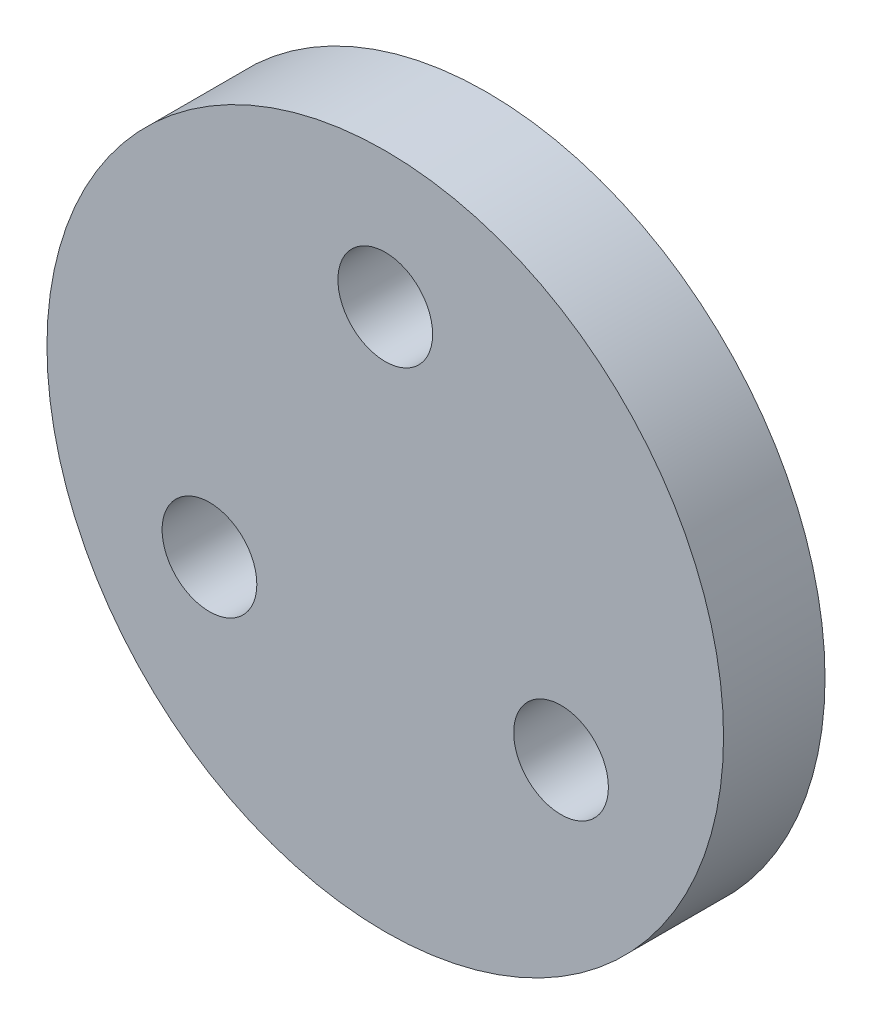
ISO-10303-21;
HEADER;
FILE_DESCRIPTION(('STEP AP214'),'2;1');
FILE_NAME('part.step','',(''),(''),'','','');
FILE_SCHEMA(('AUTOMOTIVE_DESIGN { 1 0 10303 214 1 1 1 1 }'));
ENDSEC;
DATA;
#1=APPLICATION_CONTEXT('core data for automotive mechanical design processes');
#2=APPLICATION_PROTOCOL_DEFINITION('international standard','automotive_design',2000,#1);
#3=PRODUCT_CONTEXT('',#1,'mechanical');
#4=PRODUCT('Part','Part','',(#3));
#5=PRODUCT_RELATED_PRODUCT_CATEGORY('part','',(#4));
#6=PRODUCT_DEFINITION_FORMATION('','',#4);
#7=PRODUCT_DEFINITION_CONTEXT('part definition',#1,'design');
#8=PRODUCT_DEFINITION('design','',#6,#7);
#9=PRODUCT_DEFINITION_SHAPE('','',#8);
#10=(LENGTH_UNIT() NAMED_UNIT(*) SI_UNIT(.MILLI.,.METRE.));
#11=(NAMED_UNIT(*) PLANE_ANGLE_UNIT() SI_UNIT($,.RADIAN.));
#12=(NAMED_UNIT(*) SI_UNIT($,.STERADIAN.) SOLID_ANGLE_UNIT());
#13=UNCERTAINTY_MEASURE_WITH_UNIT(LENGTH_MEASURE(1.E-05),#10,'distance_accuracy_value','');
#14=(GEOMETRIC_REPRESENTATION_CONTEXT(3) GLOBAL_UNCERTAINTY_ASSIGNED_CONTEXT((#13)) GLOBAL_UNIT_ASSIGNED_CONTEXT((#10,
#11,#12)) REPRESENTATION_CONTEXT('',''));
#15=CARTESIAN_POINT('',(0.,0.,0.));
#16=DIRECTION('',(0.,0.,1.));
#17=DIRECTION('',(1.,0.,0.));
#18=AXIS2_PLACEMENT_3D('',#15,#16,#17);
#19=CARTESIAN_POINT('',(0.,0.,5.));
#20=DIRECTION('',(0.,0.,-1.));
#21=DIRECTION('',(-1.,0.,0.));
#22=AXIS2_PLACEMENT_3D('',#19,#20,#21);
#23=CYLINDRICAL_SURFACE('',#22,3.);
#24=CARTESIAN_POINT('',(0.,0.,1.00000000000001));
#25=DIRECTION('',(0.,0.,1.));
#26=DIRECTION('',(1.,0.,0.));
#27=AXIS2_PLACEMENT_3D('',#24,#25,#26);
#28=CIRCLE('',#27,3.);
#29=CARTESIAN_POINT('',(3.,0.,1.00000000000001));
#30=VERTEX_POINT('',#29);
#31=EDGE_CURVE('E54',#30,#30,#28,.T.);
#32=ORIENTED_EDGE('',*,*,#31,.T.);
#33=EDGE_LOOP('',(#32));
#34=FACE_BOUND('',#33,.T.);
#35=CARTESIAN_POINT('',(0.,0.,5.));
#36=DIRECTION('',(0.,0.,1.));
#37=DIRECTION('',(1.,0.,0.));
#38=AXIS2_PLACEMENT_3D('',#35,#36,#37);
#39=CIRCLE('',#38,3.);
#40=CARTESIAN_POINT('',(3.,0.,5.));
#41=VERTEX_POINT('',#40);
#42=EDGE_CURVE('E59',#41,#41,#39,.T.);
#43=ORIENTED_EDGE('',*,*,#42,.F.);
#44=EDGE_LOOP('',(#43));
#45=FACE_BOUND('',#44,.T.);
#46=ADVANCED_FACE('F45',(#34,#45),#23,.T.);
#47=CARTESIAN_POINT('',(0.,0.,0.));
#48=DIRECTION('',(0.,0.,1.));
#49=DIRECTION('',(1.,0.,0.));
#50=AXIS2_PLACEMENT_3D('',#47,#48,#49);
#51=PLANE('',#50);
#52=CARTESIAN_POINT('',(0.,0.,0.));
#53=DIRECTION('',(0.,0.,1.));
#54=DIRECTION('',(1.,0.,0.));
#55=AXIS2_PLACEMENT_3D('',#52,#53,#54);
#56=CIRCLE('',#55,1.99999999999999);
#57=CARTESIAN_POINT('',(1.99999999999999,0.,0.));
#58=VERTEX_POINT('',#57);
#59=EDGE_CURVE('E10',#58,#58,#56,.F.);
#60=ORIENTED_EDGE('',*,*,#59,.T.);
#61=EDGE_LOOP('',(#60));
#62=FACE_BOUND('',#61,.T.);
#63=ADVANCED_FACE('F122',(#62),#51,.F.);
#64=CARTESIAN_POINT('',(0.,0.,8.));
#65=DIRECTION('',(0.,0.,-1.));
#66=DIRECTION('',(-1.,0.,0.));
#67=AXIS2_PLACEMENT_3D('',#64,#65,#66);
#68=CYLINDRICAL_SURFACE('',#67,10.);
#69=CARTESIAN_POINT('',(0.,0.,8.));
#70=DIRECTION('',(0.,0.,1.));
#71=DIRECTION('',(1.,0.,0.));
#72=AXIS2_PLACEMENT_3D('',#69,#70,#71);
#73=CIRCLE('',#72,10.);
#74=CARTESIAN_POINT('',(10.,0.,8.));
#75=VERTEX_POINT('',#74);
#76=EDGE_CURVE('E64',#75,#75,#73,.T.);
#77=ORIENTED_EDGE('',*,*,#76,.F.);
#78=EDGE_LOOP('',(#77));
#79=FACE_BOUND('',#78,.T.);
#80=CARTESIAN_POINT('',(0.,0.,5.));
#81=DIRECTION('',(0.,0.,1.));
#82=DIRECTION('',(1.,0.,0.));
#83=AXIS2_PLACEMENT_3D('',#80,#81,#82);
#84=CIRCLE('',#83,10.);
#85=CARTESIAN_POINT('',(10.,0.,5.));
#86=VERTEX_POINT('',#85);
#87=EDGE_CURVE('E67',#86,#86,#84,.T.);
#88=ORIENTED_EDGE('',*,*,#87,.T.);
#89=EDGE_LOOP('',(#88));
#90=FACE_BOUND('',#89,.T.);
#91=ADVANCED_FACE('F112',(#79,#90),#68,.T.);
#92=CARTESIAN_POINT('',(0.,0.,8.));
#93=DIRECTION('',(0.,0.,1.));
#94=DIRECTION('',(1.,0.,0.));
#95=AXIS2_PLACEMENT_3D('',#92,#93,#94);
#96=PLANE('',#95);
#97=CARTESIAN_POINT('',(5.19615242270662,-3.00000000000002,8.));
#98=DIRECTION('',(0.,0.,1.));
#99=DIRECTION('',(-0.500000000000004,-0.866025403784436,0.));
#100=AXIS2_PLACEMENT_3D('',#97,#98,#99);
#101=CIRCLE('',#100,1.4);
#102=CARTESIAN_POINT('',(4.49615242270661,-4.21243556529824,8.));
#103=VERTEX_POINT('',#102);
#104=EDGE_CURVE('E91',#103,#103,#101,.T.);
#105=ORIENTED_EDGE('',*,*,#104,.F.);
#106=EDGE_LOOP('',(#105));
#107=FACE_BOUND('',#106,.T.);
#108=CARTESIAN_POINT('',(-5.19615242270666,-2.99999999999995,8.));
#109=DIRECTION('',(0.,0.,1.));
#110=DIRECTION('',(-0.499999999999992,0.866025403784443,0.));
#111=AXIS2_PLACEMENT_3D('',#108,#109,#110);
#112=CIRCLE('',#111,1.4);
#113=CARTESIAN_POINT('',(-5.89615242270665,-1.78756443470173,8.));
#114=VERTEX_POINT('',#113);
#115=EDGE_CURVE('E83',#114,#114,#112,.T.);
#116=ORIENTED_EDGE('',*,*,#115,.F.);
#117=EDGE_LOOP('',(#116));
#118=FACE_BOUND('',#117,.T.);
#119=CARTESIAN_POINT('',(0.,6.,8.));
#120=DIRECTION('',(0.,0.,1.));
#121=DIRECTION('',(1.,0.,0.));
#122=AXIS2_PLACEMENT_3D('',#119,#120,#121);
#123=CIRCLE('',#122,1.4);
#124=CARTESIAN_POINT('',(1.4,6.,8.));
#125=VERTEX_POINT('',#124);
#126=EDGE_CURVE('E75',#125,#125,#123,.T.);
#127=ORIENTED_EDGE('',*,*,#126,.F.);
#128=EDGE_LOOP('',(#127));
#129=FACE_BOUND('',#128,.T.);
#130=ORIENTED_EDGE('',*,*,#76,.T.);
#131=EDGE_LOOP('',(#130));
#132=FACE_BOUND('',#131,.T.);
#133=ADVANCED_FACE('F109',(#107,#118,#129,#132),#96,.T.);
#134=CARTESIAN_POINT('',(0.,0.,5.));
#135=DIRECTION('',(0.,0.,1.));
#136=DIRECTION('',(1.,0.,0.));
#137=AXIS2_PLACEMENT_3D('',#134,#135,#136);
#138=PLANE('',#137);
#139=CARTESIAN_POINT('',(5.19615242270662,-3.00000000000002,5.));
#140=DIRECTION('',(0.,0.,1.));
#141=DIRECTION('',(-0.500000000000004,-0.866025403784436,0.));
#142=AXIS2_PLACEMENT_3D('',#139,#140,#141);
#143=CIRCLE('',#142,1.4);
#144=CARTESIAN_POINT('',(4.49615242270661,-4.21243556529824,5.));
#145=VERTEX_POINT('',#144);
#146=EDGE_CURVE('E79',#145,#145,#143,.T.);
#147=ORIENTED_EDGE('',*,*,#146,.T.);
#148=EDGE_LOOP('',(#147));
#149=FACE_BOUND('',#148,.T.);
#150=CARTESIAN_POINT('',(-5.19615242270666,-2.99999999999995,5.));
#151=DIRECTION('',(0.,0.,1.));
#152=DIRECTION('',(-0.499999999999992,0.866025403784443,0.));
#153=AXIS2_PLACEMENT_3D('',#150,#151,#152);
#154=CIRCLE('',#153,1.4);
#155=CARTESIAN_POINT('',(-5.89615242270665,-1.78756443470173,5.));
#156=VERTEX_POINT('',#155);
#157=EDGE_CURVE('E87',#156,#156,#154,.T.);
#158=ORIENTED_EDGE('',*,*,#157,.T.);
#159=EDGE_LOOP('',(#158));
#160=FACE_BOUND('',#159,.T.);
#161=CARTESIAN_POINT('',(0.,6.,5.));
#162=DIRECTION('',(0.,0.,1.));
#163=DIRECTION('',(1.,0.,0.));
#164=AXIS2_PLACEMENT_3D('',#161,#162,#163);
#165=CIRCLE('',#164,1.4);
#166=CARTESIAN_POINT('',(1.4,6.,5.));
#167=VERTEX_POINT('',#166);
#168=EDGE_CURVE('E71',#167,#167,#165,.T.);
#169=ORIENTED_EDGE('',*,*,#168,.T.);
#170=EDGE_LOOP('',(#169));
#171=FACE_BOUND('',#170,.T.);
#172=ORIENTED_EDGE('',*,*,#42,.T.);
#173=EDGE_LOOP('',(#172));
#174=FACE_BOUND('',#173,.T.);
#175=ORIENTED_EDGE('',*,*,#87,.F.);
#176=EDGE_LOOP('',(#175));
#177=FACE_BOUND('',#176,.T.);
#178=ADVANCED_FACE('F99',(#149,#160,#171,#174,#177),#138,.F.);
#179=CARTESIAN_POINT('',(0.,6.,5.));
#180=DIRECTION('',(0.,0.,1.));
#181=DIRECTION('',(1.,0.,0.));
#182=AXIS2_PLACEMENT_3D('',#179,#180,#181);
#183=CYLINDRICAL_SURFACE('',#182,1.4);
#184=ORIENTED_EDGE('',*,*,#168,.F.);
#185=EDGE_LOOP('',(#184));
#186=FACE_BOUND('',#185,.T.);
#187=ORIENTED_EDGE('',*,*,#126,.T.);
#188=EDGE_LOOP('',(#187));
#189=FACE_BOUND('',#188,.T.);
#190=ADVANCED_FACE('F127',(#186,#189),#183,.F.);
#191=CARTESIAN_POINT('',(-5.19615242270666,-2.99999999999995,5.));
#192=DIRECTION('',(0.,0.,1.));
#193=DIRECTION('',(1.,0.,0.));
#194=AXIS2_PLACEMENT_3D('',#191,#192,#193);
#195=CYLINDRICAL_SURFACE('',#194,1.4);
#196=ORIENTED_EDGE('',*,*,#157,.F.);
#197=EDGE_LOOP('',(#196));
#198=FACE_BOUND('',#197,.T.);
#199=ORIENTED_EDGE('',*,*,#115,.T.);
#200=EDGE_LOOP('',(#199));
#201=FACE_BOUND('',#200,.T.);
#202=ADVANCED_FACE('F105',(#198,#201),#195,.F.);
#203=CARTESIAN_POINT('',(5.19615242270662,-3.00000000000002,5.));
#204=DIRECTION('',(0.,0.,1.));
#205=DIRECTION('',(1.,0.,0.));
#206=AXIS2_PLACEMENT_3D('',#203,#204,#205);
#207=CYLINDRICAL_SURFACE('',#206,1.4);
#208=ORIENTED_EDGE('',*,*,#146,.F.);
#209=EDGE_LOOP('',(#208));
#210=FACE_BOUND('',#209,.T.);
#211=ORIENTED_EDGE('',*,*,#104,.T.);
#212=EDGE_LOOP('',(#211));
#213=FACE_BOUND('',#212,.T.);
#214=ADVANCED_FACE('F102',(#210,#213),#207,.F.);
#215=CARTESIAN_POINT('',(0.,0.,1.00000000000001));
#216=DIRECTION('',(0.,0.,1.));
#217=DIRECTION('',(1.,0.,0.));
#218=AXIS2_PLACEMENT_3D('',#215,#216,#217);
#219=CONICAL_SURFACE('',#218,3.,0.78539816339745);
#220=ORIENTED_EDGE('',*,*,#59,.F.);
#221=EDGE_LOOP('',(#220));
#222=FACE_BOUND('',#221,.T.);
#223=ORIENTED_EDGE('',*,*,#31,.F.);
#224=EDGE_LOOP('',(#223));
#225=FACE_BOUND('',#224,.T.);
#226=ADVANCED_FACE('F48',(#222,#225),#219,.T.);
#227=CLOSED_SHELL('',(#46,#63,#91,#133,#178,#190,#202,#214,#226));
#228=MANIFOLD_SOLID_BREP('B2',#227);
#229=ADVANCED_BREP_SHAPE_REPRESENTATION('',(#18,#228),#14);
#230=SHAPE_DEFINITION_REPRESENTATION(#9,#229);
ENDSEC;
END-ISO-10303-21;
